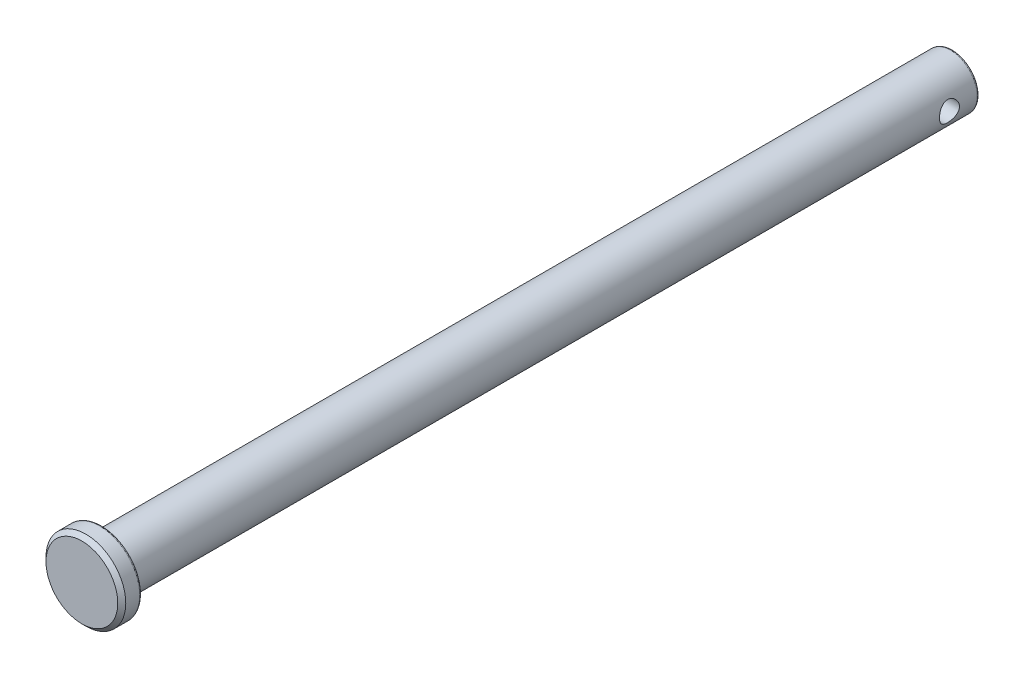
ISO-10303-21;
HEADER;
FILE_DESCRIPTION(('STEP AP214'),'2;1');
FILE_NAME('part.step','',(''),(''),'','','');
FILE_SCHEMA(('AUTOMOTIVE_DESIGN { 1 0 10303 214 1 1 1 1 }'));
ENDSEC;
DATA;
#1=APPLICATION_CONTEXT('core data for automotive mechanical design processes');
#2=APPLICATION_PROTOCOL_DEFINITION('international standard','automotive_design',2000,#1);
#3=PRODUCT_CONTEXT('',#1,'mechanical');
#4=PRODUCT('Part','Part','',(#3));
#5=PRODUCT_RELATED_PRODUCT_CATEGORY('part','',(#4));
#6=PRODUCT_DEFINITION_FORMATION('','',#4);
#7=PRODUCT_DEFINITION_CONTEXT('part definition',#1,'design');
#8=PRODUCT_DEFINITION('design','',#6,#7);
#9=PRODUCT_DEFINITION_SHAPE('','',#8);
#10=(LENGTH_UNIT() NAMED_UNIT(*) SI_UNIT(.MILLI.,.METRE.));
#11=(NAMED_UNIT(*) PLANE_ANGLE_UNIT() SI_UNIT($,.RADIAN.));
#12=(NAMED_UNIT(*) SI_UNIT($,.STERADIAN.) SOLID_ANGLE_UNIT());
#13=UNCERTAINTY_MEASURE_WITH_UNIT(LENGTH_MEASURE(1.E-05),#10,'distance_accuracy_value','');
#14=(GEOMETRIC_REPRESENTATION_CONTEXT(3) GLOBAL_UNCERTAINTY_ASSIGNED_CONTEXT((#13)) GLOBAL_UNIT_ASSIGNED_CONTEXT((#10,
#11,#12)) REPRESENTATION_CONTEXT('',''));
#15=CARTESIAN_POINT('',(0.,0.,0.));
#16=DIRECTION('',(0.,0.,1.));
#17=DIRECTION('',(1.,0.,0.));
#18=AXIS2_PLACEMENT_3D('',#15,#16,#17);
#19=CARTESIAN_POINT('',(0.,4.28625,51.990625));
#20=DIRECTION('',(0.,0.,-1.));
#21=DIRECTION('',(-1.,0.,0.));
#22=AXIS2_PLACEMENT_3D('',#19,#20,#21);
#23=PLANE('',#22);
#24=CARTESIAN_POINT('',(0.,0.,51.9906250000872));
#25=DIRECTION('',(0.,0.,-1.));
#26=DIRECTION('',(-1.,0.,0.));
#27=AXIS2_PLACEMENT_3D('',#24,#25,#26);
#28=CIRCLE('',#27,4.28625000000693);
#29=CARTESIAN_POINT('',(-4.28625000000693,0.,51.9906250000872));
#30=VERTEX_POINT('',#29);
#31=EDGE_CURVE('E169',#30,#30,#28,.T.);
#32=ORIENTED_EDGE('',*,*,#31,.F.);
#33=EDGE_LOOP('',(#32));
#34=FACE_BOUND('',#33,.T.);
#35=ADVANCED_FACE('F16',(#34),#23,.F.);
#36=CARTESIAN_POINT('',(0.,0.,51.5143750000107));
#37=DIRECTION('',(0.,0.,-1.));
#38=DIRECTION('',(-1.,0.,0.));
#39=AXIS2_PLACEMENT_3D('',#36,#37,#38);
#40=CONICAL_SURFACE('',#39,4.76250000008349,0.785398163397448);
#41=CARTESIAN_POINT('',(0.,0.,51.514375));
#42=DIRECTION('',(0.,0.,1.));
#43=DIRECTION('',(1.,0.,0.));
#44=AXIS2_PLACEMENT_3D('',#41,#42,#43);
#45=CIRCLE('',#44,4.7625);
#46=CARTESIAN_POINT('',(4.7625,0.,51.514375));
#47=VERTEX_POINT('',#46);
#48=EDGE_CURVE('E171',#47,#47,#45,.F.);
#49=ORIENTED_EDGE('',*,*,#48,.F.);
#50=EDGE_LOOP('',(#49));
#51=FACE_BOUND('',#50,.T.);
#52=ORIENTED_EDGE('',*,*,#31,.T.);
#53=EDGE_LOOP('',(#52));
#54=FACE_BOUND('',#53,.T.);
#55=ADVANCED_FACE('F225',(#51,#54),#40,.T.);
#56=CARTESIAN_POINT('',(0.,0.,51.990625));
#57=DIRECTION('',(0.,0.,1.));
#58=DIRECTION('',(1.,0.,0.));
#59=AXIS2_PLACEMENT_3D('',#56,#57,#58);
#60=CYLINDRICAL_SURFACE('',#59,4.7625);
#61=ORIENTED_EDGE('',*,*,#48,.T.);
#62=EDGE_LOOP('',(#61));
#63=FACE_BOUND('',#62,.T.);
#64=CARTESIAN_POINT('',(0.,0.,49.863375));
#65=DIRECTION('',(0.,0.,1.));
#66=DIRECTION('',(1.,0.,0.));
#67=AXIS2_PLACEMENT_3D('',#64,#65,#66);
#68=CIRCLE('',#67,4.7625);
#69=CARTESIAN_POINT('',(4.7625,0.,49.863375));
#70=VERTEX_POINT('',#69);
#71=EDGE_CURVE('E64',#70,#70,#68,.F.);
#72=ORIENTED_EDGE('',*,*,#71,.F.);
#73=EDGE_LOOP('',(#72));
#74=FACE_BOUND('',#73,.T.);
#75=ADVANCED_FACE('F190',(#63,#74),#60,.T.);
#76=CARTESIAN_POINT('',(0.,0.,49.863375));
#77=DIRECTION('',(0.,0.,1.));
#78=DIRECTION('',(1.,0.,0.));
#79=AXIS2_PLACEMENT_3D('',#76,#77,#78);
#80=TOROIDAL_SURFACE('',#79,4.5085,0.253999999999999);
#81=ORIENTED_EDGE('',*,*,#71,.T.);
#82=EDGE_LOOP('',(#81));
#83=FACE_BOUND('',#82,.T.);
#84=CARTESIAN_POINT('',(0.,0.,49.609375));
#85=DIRECTION('',(0.,0.,1.));
#86=DIRECTION('',(1.,0.,0.));
#87=AXIS2_PLACEMENT_3D('',#84,#85,#86);
#88=CIRCLE('',#87,4.5085);
#89=CARTESIAN_POINT('',(4.5085,0.,49.609375));
#90=VERTEX_POINT('',#89);
#91=CARTESIAN_POINT('',(-4.5085,0.,49.609375));
#92=VERTEX_POINT('',#91);
#93=EDGE_CURVE('E54',#90,#92,#88,.T.);
#94=ORIENTED_EDGE('',*,*,#93,.T.);
#95=CARTESIAN_POINT('',(0.,0.,49.609375));
#96=DIRECTION('',(0.,0.,1.));
#97=DIRECTION('',(-1.,0.,0.));
#98=AXIS2_PLACEMENT_3D('',#95,#96,#97);
#99=CIRCLE('',#98,4.5085);
#100=EDGE_CURVE('E52',#92,#90,#99,.T.);
#101=ORIENTED_EDGE('',*,*,#100,.T.);
#102=EDGE_LOOP('',(#94,#101));
#103=FACE_BOUND('',#102,.T.);
#104=ADVANCED_FACE('F56',(#83,#103),#80,.T.);
#105=CARTESIAN_POINT('',(0.,0.,-51.990625));
#106=DIRECTION('',(0.,0.,1.));
#107=DIRECTION('',(1.,0.,0.));
#108=AXIS2_PLACEMENT_3D('',#105,#106,#107);
#109=PLANE('',#108);
#110=CARTESIAN_POINT('',(0.,0.,-51.990625));
#111=DIRECTION('',(0.,0.,1.));
#112=DIRECTION('',(-1.,0.,0.));
#113=AXIS2_PLACEMENT_3D('',#110,#111,#112);
#114=CIRCLE('',#113,2.921);
#115=CARTESIAN_POINT('',(-2.921,0.,-51.990625));
#116=VERTEX_POINT('',#115);
#117=CARTESIAN_POINT('',(2.921,0.,-51.990625));
#118=VERTEX_POINT('',#117);
#119=EDGE_CURVE('E59',#116,#118,#114,.T.);
#120=ORIENTED_EDGE('',*,*,#119,.F.);
#121=CARTESIAN_POINT('',(0.,0.,-51.990625));
#122=DIRECTION('',(0.,0.,1.));
#123=DIRECTION('',(1.,0.,0.));
#124=AXIS2_PLACEMENT_3D('',#121,#122,#123);
#125=CIRCLE('',#124,2.921);
#126=EDGE_CURVE('E151',#118,#116,#125,.T.);
#127=ORIENTED_EDGE('',*,*,#126,.F.);
#128=EDGE_LOOP('',(#120,#127));
#129=FACE_BOUND('',#128,.T.);
#130=ADVANCED_FACE('F84',(#129),#109,.F.);
#131=CARTESIAN_POINT('',(0.,3.42899999999999,49.609375));
#132=DIRECTION('',(0.,0.,1.));
#133=DIRECTION('',(1.,0.,0.));
#134=AXIS2_PLACEMENT_3D('',#131,#132,#133);
#135=PLANE('',#134);
#136=CARTESIAN_POINT('',(0.,0.,49.609375));
#137=DIRECTION('',(0.,0.,-1.));
#138=DIRECTION('',(1.,0.,0.));
#139=AXIS2_PLACEMENT_3D('',#136,#137,#138);
#140=CIRCLE('',#139,3.42899999999999);
#141=CARTESIAN_POINT('',(-3.42899999999999,0.,49.609375));
#142=VERTEX_POINT('',#141);
#143=CARTESIAN_POINT('',(3.42899999999999,0.,49.609375));
#144=VERTEX_POINT('',#143);
#145=EDGE_CURVE('E154',#142,#144,#140,.F.);
#146=ORIENTED_EDGE('',*,*,#145,.T.);
#147=CARTESIAN_POINT('',(0.,0.,49.609375));
#148=DIRECTION('',(0.,0.,-1.));
#149=DIRECTION('',(-1.,0.,0.));
#150=AXIS2_PLACEMENT_3D('',#147,#148,#149);
#151=CIRCLE('',#150,3.42899999999999);
#152=EDGE_CURVE('E37',#144,#142,#151,.F.);
#153=ORIENTED_EDGE('',*,*,#152,.T.);
#154=EDGE_LOOP('',(#146,#153));
#155=FACE_BOUND('',#154,.T.);
#156=ORIENTED_EDGE('',*,*,#100,.F.);
#157=ORIENTED_EDGE('',*,*,#93,.F.);
#158=EDGE_LOOP('',(#156,#157));
#159=FACE_BOUND('',#158,.T.);
#160=ADVANCED_FACE('F63',(#155,#159),#135,.F.);
#161=CARTESIAN_POINT('',(0.,0.,-51.736625));
#162=DIRECTION('',(0.,0.,1.));
#163=DIRECTION('',(1.,0.,0.));
#164=AXIS2_PLACEMENT_3D('',#161,#162,#163);
#165=TOROIDAL_SURFACE('',#164,2.921,0.254000000000002);
#166=CARTESIAN_POINT('',(0.,0.,-51.736625));
#167=DIRECTION('',(0.,0.,1.));
#168=DIRECTION('',(1.,0.,0.));
#169=AXIS2_PLACEMENT_3D('',#166,#167,#168);
#170=CIRCLE('',#169,3.17499999999999);
#171=CARTESIAN_POINT('',(3.17499999999999,0.,-51.736625));
#172=VERTEX_POINT('',#171);
#173=EDGE_CURVE('E115',#172,#172,#170,.T.);
#174=ORIENTED_EDGE('',*,*,#173,.F.);
#175=EDGE_LOOP('',(#174));
#176=FACE_BOUND('',#175,.T.);
#177=ORIENTED_EDGE('',*,*,#126,.T.);
#178=ORIENTED_EDGE('',*,*,#119,.T.);
#179=EDGE_LOOP('',(#177,#178));
#180=FACE_BOUND('',#179,.T.);
#181=ADVANCED_FACE('F83',(#176,#180),#165,.T.);
#182=CARTESIAN_POINT('',(0.,0.,49.355375));
#183=DIRECTION('',(0.,0.,1.));
#184=DIRECTION('',(1.,0.,0.));
#185=AXIS2_PLACEMENT_3D('',#182,#183,#184);
#186=TOROIDAL_SURFACE('',#185,3.42899999999999,0.253999999999999);
#187=ORIENTED_EDGE('',*,*,#152,.F.);
#188=ORIENTED_EDGE('',*,*,#145,.F.);
#189=EDGE_LOOP('',(#187,#188));
#190=FACE_BOUND('',#189,.T.);
#191=CARTESIAN_POINT('',(0.,0.,49.355375));
#192=DIRECTION('',(0.,0.,1.));
#193=DIRECTION('',(1.,0.,0.));
#194=AXIS2_PLACEMENT_3D('',#191,#192,#193);
#195=CIRCLE('',#194,3.17499999999999);
#196=CARTESIAN_POINT('',(3.17499999999999,0.,49.355375));
#197=VERTEX_POINT('',#196);
#198=EDGE_CURVE('E29',#197,#197,#195,.F.);
#199=ORIENTED_EDGE('',*,*,#198,.F.);
#200=EDGE_LOOP('',(#199));
#201=FACE_BOUND('',#200,.T.);
#202=ADVANCED_FACE('F117',(#190,#201),#186,.F.);
#203=CARTESIAN_POINT('',(-4.7625,0.,-48.434625));
#204=DIRECTION('',(1.,0.,0.));
#205=DIRECTION('',(0.,0.,-1.));
#206=AXIS2_PLACEMENT_3D('',#203,#204,#205);
#207=CYLINDRICAL_SURFACE('',#206,1.1938);
#208=CARTESIAN_POINT('',(-3.17499999999999,0.,-49.628425));
#209=CARTESIAN_POINT('',(-3.17499714192098,0.0645416416633324,-49.6284212673097));
#210=CARTESIAN_POINT('',(-3.17301098938539,0.129143548946435,-49.6231658412069));
#211=CARTESIAN_POINT('',(-3.16526872569118,0.256486193947588,-49.6023361600074));
#212=CARTESIAN_POINT('',(-3.1595068723136,0.319223944426657,-49.5867461873481));
#213=CARTESIAN_POINT('',(-3.1448366800971,0.440876308456711,-49.5458821277179));
#214=CARTESIAN_POINT('',(-3.13593657209552,0.499800450192939,-49.5206333587259));
#215=CARTESIAN_POINT('',(-3.11587722819063,0.612550306594369,-49.4612712636796));
#216=CARTESIAN_POINT('',(-3.10471810813051,0.666376282488205,-49.4271583921552));
#217=CARTESIAN_POINT('',(-3.08075677202739,0.769731189264313,-49.3495074164179));
#218=CARTESIAN_POINT('',(-3.06790775764152,0.819014039647655,-49.3056563121728));
#219=CARTESIAN_POINT('',(-3.0422442495059,0.90972609486744,-49.2104365184516));
#220=CARTESIAN_POINT('',(-3.02942976958099,0.951152514360447,-49.1590651742164));
#221=CARTESIAN_POINT('',(-3.00474372304801,1.02653622777135,-49.0478646110331));
#222=CARTESIAN_POINT('',(-2.99292709451722,1.06014653651827,-48.9877867480051));
#223=CARTESIAN_POINT('',(-2.97230049762621,1.11667678487838,-48.8623169573107));
#224=CARTESIAN_POINT('',(-2.9634893176016,1.13960103400967,-48.7969271843682));
#225=CARTESIAN_POINT('',(-2.95037010700156,1.17313911276858,-48.6655133268022));
#226=CARTESIAN_POINT('',(-2.94589152187727,1.18422116738411,-48.5996263411277));
#227=CARTESIAN_POINT('',(-2.94144571988617,1.19522418789459,-48.4667874603474));
#228=CARTESIAN_POINT('',(-2.9414766229803,1.19514980499064,-48.3998360206607));
#229=CARTESIAN_POINT('',(-2.94589929518468,1.18420002661998,-48.271061407958));
#230=CARTESIAN_POINT('',(-2.9500283438826,1.17397533042635,-48.2091722046416));
#231=CARTESIAN_POINT('',(-2.96174530896249,1.14409116689025,-48.0880625206669));
#232=CARTESIAN_POINT('',(-2.96933376184123,1.12443023611776,-48.0288424555141));
#233=CARTESIAN_POINT('',(-2.98727219974783,1.07587553842102,-47.9134287367205));
#234=CARTESIAN_POINT('',(-2.99767192435919,1.04681341122358,-47.8573139844748));
#235=CARTESIAN_POINT('',(-3.02004406243738,0.980400021414327,-47.7505718888183));
#236=CARTESIAN_POINT('',(-3.03201694881545,0.943046263902219,-47.6999462038728));
#237=CARTESIAN_POINT('',(-3.05717228830171,0.85814287291554,-47.6020229627208));
#238=CARTESIAN_POINT('',(-3.07038185352712,0.810075437066362,-47.5551802726352));
#239=CARTESIAN_POINT('',(-3.09583259140545,0.706598363697191,-47.4700701769165));
#240=CARTESIAN_POINT('',(-3.10807331454124,0.651185349547343,-47.4318067369131));
#241=CARTESIAN_POINT('',(-3.1304552633654,0.533408277704012,-47.3644326728977));
#242=CARTESIAN_POINT('',(-3.14055908719678,0.47094578939141,-47.3354811055016));
#243=CARTESIAN_POINT('',(-3.15723659440407,0.341623992721842,-47.2886933559786));
#244=CARTESIAN_POINT('',(-3.16381741311849,0.274773881693547,-47.2708346949148));
#245=CARTESIAN_POINT('',(-3.17048346022602,0.172734012582197,-47.2528786011033));
#246=CARTESIAN_POINT('',(-3.17217139867951,0.138370440708816,-47.2483651092517));
#247=CARTESIAN_POINT('',(-3.17443043464748,0.0693437120818132,-47.2423373106619));
#248=CARTESIAN_POINT('',(-3.17500153574913,0.0346805562907873,-47.2408229942906));
#249=CARTESIAN_POINT('',(-3.17499714192098,-0.0645416416633315,-47.2408287326903));
#250=CARTESIAN_POINT('',(-3.17301098938539,-0.129143548946435,-47.246084158793));
#251=CARTESIAN_POINT('',(-3.16526872569118,-0.256486193947588,-47.2669138399926));
#252=CARTESIAN_POINT('',(-3.1595068723136,-0.319223944426657,-47.2825038126519));
#253=CARTESIAN_POINT('',(-3.1448366800971,-0.440876308456713,-47.3233678722821));
#254=CARTESIAN_POINT('',(-3.13593657209552,-0.499800450192943,-47.348616641274));
#255=CARTESIAN_POINT('',(-3.11587722819062,-0.612550306594373,-47.4079787363203));
#256=CARTESIAN_POINT('',(-3.1047181081305,-0.666376282488207,-47.4420916078448));
#257=CARTESIAN_POINT('',(-3.08075677202739,-0.769731189264313,-47.5197425835821));
#258=CARTESIAN_POINT('',(-3.06790775764152,-0.819014039647654,-47.5635936878271));
#259=CARTESIAN_POINT('',(-3.0422442495059,-0.90972609486744,-47.6588134815483));
#260=CARTESIAN_POINT('',(-3.02942976958099,-0.951152514360449,-47.7101848257836));
#261=CARTESIAN_POINT('',(-3.00474372304801,-1.02653622777135,-47.8213853889669));
#262=CARTESIAN_POINT('',(-2.99292709451722,-1.06014653651827,-47.8814632519949));
#263=CARTESIAN_POINT('',(-2.97230049762621,-1.11667678487838,-48.0069330426893));
#264=CARTESIAN_POINT('',(-2.9634893176016,-1.13960103400967,-48.0723228156318));
#265=CARTESIAN_POINT('',(-2.95037010700156,-1.17313911276858,-48.2037366731978));
#266=CARTESIAN_POINT('',(-2.94589152187727,-1.18422116738411,-48.2696236588722));
#267=CARTESIAN_POINT('',(-2.94144571988617,-1.19522418789459,-48.4024625396526));
#268=CARTESIAN_POINT('',(-2.9414766229803,-1.19514980499064,-48.4694139793393));
#269=CARTESIAN_POINT('',(-2.94589929518468,-1.18420002661998,-48.598188592042));
#270=CARTESIAN_POINT('',(-2.9500283438826,-1.17397533042635,-48.6600777953584));
#271=CARTESIAN_POINT('',(-2.96174530896249,-1.14409116689025,-48.7811874793331));
#272=CARTESIAN_POINT('',(-2.96933376184123,-1.12443023611776,-48.8404075444859));
#273=CARTESIAN_POINT('',(-2.98727219974783,-1.07587553842102,-48.9558212632795));
#274=CARTESIAN_POINT('',(-2.99767192435919,-1.04681341122358,-49.0119360155252));
#275=CARTESIAN_POINT('',(-3.02004406243738,-0.980400021414327,-49.1186781111817));
#276=CARTESIAN_POINT('',(-3.03201694881545,-0.943046263902218,-49.1693037961271));
#277=CARTESIAN_POINT('',(-3.05717228830171,-0.858142872915539,-49.2672270372792));
#278=CARTESIAN_POINT('',(-3.07038185352712,-0.810075437066361,-49.3140697273648));
#279=CARTESIAN_POINT('',(-3.09583259140545,-0.706598363697188,-49.3991798230835));
#280=CARTESIAN_POINT('',(-3.10807331454124,-0.651185349547335,-49.4374432630869));
#281=CARTESIAN_POINT('',(-3.1304552633654,-0.533408277704002,-49.5048173271023));
#282=CARTESIAN_POINT('',(-3.14055908719678,-0.470945789391402,-49.5337688944984));
#283=CARTESIAN_POINT('',(-3.15723659440407,-0.341623992721837,-49.5805566440214));
#284=CARTESIAN_POINT('',(-3.16381741311849,-0.274773881693541,-49.5984153050852));
#285=CARTESIAN_POINT('',(-3.17048346022602,-0.172734012582193,-49.6163713988967));
#286=CARTESIAN_POINT('',(-3.17217139867951,-0.138370440708813,-49.6208848907483));
#287=CARTESIAN_POINT('',(-3.17443043464748,-0.0693437120818108,-49.6269126893381));
#288=CARTESIAN_POINT('',(-3.17500153574913,-0.0346805562907855,-49.6284270057094));
#289=CARTESIAN_POINT('',(-3.17499999999999,0.,-49.628425));
#290=B_SPLINE_CURVE_WITH_KNOTS('',3,(#208,#209,#210,#211,#212,#213,#214,#215,#216,#217,#218,
#219,#220,#221,#222,#223,#224,#225,#226,#227,#228,#229,#230,#231,#232,#233,#234,#235,#236,#237,
#238,#239,#240,#241,#242,#243,#244,#245,#246,#247,#248,#249,#250,#251,#252,#253,#254,#255,#256,
#257,#258,#259,#260,#261,#262,#263,#264,#265,#266,#267,#268,#269,#270,#271,#272,#273,#274,#275,
#276,#277,#278,#279,#280,#281,#282,#283,#284,#285,#286,#287,#288,#289),.UNSPECIFIED.,.T.,.F.,(4,
2,2,2,2,2,2,2,2,2,2,2,2,2,2,2,2,2,2,2,2,2,2,2,2,2,2,2,2,2,2,2,2,2,2,2,2,2,2,2,4),(0.,
0.193490592074804,0.387276136552926,0.58055716601698,0.773828286449741,0.974560038218329,
1.17536282299532,1.38385917810834,1.59227137705345,1.79209802846991,1.9918413709127,
2.17955630691759,2.36730036433517,2.55861231069918,2.74998189986394,2.95426053883556,
3.1586334087684,3.36633165080836,3.57360762309685,3.67757744398216,3.78154693092504,
3.97503752299985,4.16882306747797,4.36210409694203,4.55537521737479,4.75610696914338,
4.95690975392037,5.16540610903339,5.3738183079785,5.57364495939496,5.77338830183774,
5.96110323784263,6.14884729526022,6.34015924162422,6.53152883078899,6.73580746976061,
6.94018033969345,7.14787858173341,7.3551545540219,7.45912437490721,7.56309386185009),.UNSPECIFIED.);
#291=CARTESIAN_POINT('',(-3.17499999999999,0.,-49.628425));
#292=VERTEX_POINT('',#291);
#293=EDGE_CURVE('E156',#292,#292,#290,.T.);
#294=ORIENTED_EDGE('',*,*,#293,.F.);
#295=EDGE_LOOP('',(#294));
#296=FACE_BOUND('',#295,.T.);
#297=CARTESIAN_POINT('',(3.17499999999999,0.,-47.240825));
#298=CARTESIAN_POINT('',(3.17499714192098,0.0645416416633326,-47.2408287326903));
#299=CARTESIAN_POINT('',(3.17301098938539,0.129143548946436,-47.246084158793));
#300=CARTESIAN_POINT('',(3.16526872569118,0.256486193947589,-47.2669138399926));
#301=CARTESIAN_POINT('',(3.1595068723136,0.319223944426658,-47.2825038126519));
#302=CARTESIAN_POINT('',(3.1448366800971,0.440876308456712,-47.3233678722821));
#303=CARTESIAN_POINT('',(3.13593657209552,0.499800450192941,-47.348616641274));
#304=CARTESIAN_POINT('',(3.11587722819062,0.612550306594371,-47.4079787363203));
#305=CARTESIAN_POINT('',(3.1047181081305,0.666376282488207,-47.4420916078448));
#306=CARTESIAN_POINT('',(3.08075677202739,0.769731189264313,-47.5197425835821));
#307=CARTESIAN_POINT('',(3.06790775764152,0.819014039647655,-47.5635936878271));
#308=CARTESIAN_POINT('',(3.0422442495059,0.90972609486744,-47.6588134815483));
#309=CARTESIAN_POINT('',(3.02942976958099,0.951152514360449,-47.7101848257836));
#310=CARTESIAN_POINT('',(3.00474372304801,1.02653622777135,-47.8213853889669));
#311=CARTESIAN_POINT('',(2.99292709451722,1.06014653651827,-47.8814632519949));
#312=CARTESIAN_POINT('',(2.97230049762621,1.11667678487838,-48.0069330426893));
#313=CARTESIAN_POINT('',(2.9634893176016,1.13960103400967,-48.0723228156318));
#314=CARTESIAN_POINT('',(2.95037010700156,1.17313911276858,-48.2037366731978));
#315=CARTESIAN_POINT('',(2.94589152187727,1.18422116738411,-48.2696236588722));
#316=CARTESIAN_POINT('',(2.94144571988617,1.19522418789459,-48.4024625396526));
#317=CARTESIAN_POINT('',(2.9414766229803,1.19514980499064,-48.4694139793393));
#318=CARTESIAN_POINT('',(2.94589929518468,1.18420002661998,-48.598188592042));
#319=CARTESIAN_POINT('',(2.9500283438826,1.17397533042635,-48.6600777953584));
#320=CARTESIAN_POINT('',(2.96174530896249,1.14409116689025,-48.7811874793331));
#321=CARTESIAN_POINT('',(2.96933376184123,1.12443023611776,-48.8404075444859));
#322=CARTESIAN_POINT('',(2.98727219974783,1.07587553842102,-48.9558212632795));
#323=CARTESIAN_POINT('',(2.99767192435919,1.04681341122358,-49.0119360155252));
#324=CARTESIAN_POINT('',(3.02004406243738,0.980400021414327,-49.1186781111817));
#325=CARTESIAN_POINT('',(3.03201694881545,0.943046263902218,-49.1693037961271));
#326=CARTESIAN_POINT('',(3.05717228830171,0.858142872915539,-49.2672270372792));
#327=CARTESIAN_POINT('',(3.07038185352712,0.810075437066361,-49.3140697273648));
#328=CARTESIAN_POINT('',(3.09583259140545,0.706598363697187,-49.3991798230835));
#329=CARTESIAN_POINT('',(3.10807331454124,0.651185349547334,-49.4374432630869));
#330=CARTESIAN_POINT('',(3.1304552633654,0.533408277704003,-49.5048173271023));
#331=CARTESIAN_POINT('',(3.14055908719678,0.470945789391405,-49.5337688944984));
#332=CARTESIAN_POINT('',(3.15723659440407,0.34162399272184,-49.5805566440214));
#333=CARTESIAN_POINT('',(3.16381741311849,0.274773881693543,-49.5984153050852));
#334=CARTESIAN_POINT('',(3.17048346022602,0.172734012582192,-49.6163713988967));
#335=CARTESIAN_POINT('',(3.17217139867951,0.138370440708813,-49.6208848907483));
#336=CARTESIAN_POINT('',(3.17443043464748,0.0693437120818111,-49.6269126893381));
#337=CARTESIAN_POINT('',(3.17500153574913,0.0346805562907858,-49.6284270057094));
#338=CARTESIAN_POINT('',(3.17499714192098,-0.0645416416633319,-49.6284212673097));
#339=CARTESIAN_POINT('',(3.17301098938539,-0.129143548946435,-49.6231658412069));
#340=CARTESIAN_POINT('',(3.16526872569118,-0.256486193947587,-49.6023361600074));
#341=CARTESIAN_POINT('',(3.1595068723136,-0.319223944426656,-49.5867461873481));
#342=CARTESIAN_POINT('',(3.1448366800971,-0.440876308456712,-49.5458821277179));
#343=CARTESIAN_POINT('',(3.13593657209552,-0.499800450192941,-49.5206333587259));
#344=CARTESIAN_POINT('',(3.11587722819062,-0.612550306594372,-49.4612712636796));
#345=CARTESIAN_POINT('',(3.1047181081305,-0.666376282488207,-49.4271583921552));
#346=CARTESIAN_POINT('',(3.08075677202739,-0.769731189264312,-49.3495074164179));
#347=CARTESIAN_POINT('',(3.06790775764152,-0.819014039647652,-49.3056563121728));
#348=CARTESIAN_POINT('',(3.0422442495059,-0.909726094867437,-49.2104365184516));
#349=CARTESIAN_POINT('',(3.02942976958099,-0.951152514360446,-49.1590651742164));
#350=CARTESIAN_POINT('',(3.00474372304801,-1.02653622777135,-49.0478646110331));
#351=CARTESIAN_POINT('',(2.99292709451722,-1.06014653651827,-48.9877867480051));
#352=CARTESIAN_POINT('',(2.97230049762621,-1.11667678487838,-48.8623169573107));
#353=CARTESIAN_POINT('',(2.9634893176016,-1.13960103400967,-48.7969271843682));
#354=CARTESIAN_POINT('',(2.95037010700156,-1.17313911276858,-48.6655133268022));
#355=CARTESIAN_POINT('',(2.94589152187727,-1.18422116738411,-48.5996263411277));
#356=CARTESIAN_POINT('',(2.94144571988617,-1.19522418789459,-48.4667874603474));
#357=CARTESIAN_POINT('',(2.9414766229803,-1.19514980499064,-48.3998360206607));
#358=CARTESIAN_POINT('',(2.94589929518468,-1.18420002661998,-48.271061407958));
#359=CARTESIAN_POINT('',(2.9500283438826,-1.17397533042635,-48.2091722046416));
#360=CARTESIAN_POINT('',(2.96174530896249,-1.14409116689025,-48.0880625206669));
#361=CARTESIAN_POINT('',(2.96933376184123,-1.12443023611776,-48.0288424555141));
#362=CARTESIAN_POINT('',(2.98727219974783,-1.07587553842102,-47.9134287367205));
#363=CARTESIAN_POINT('',(2.99767192435919,-1.04681341122358,-47.8573139844748));
#364=CARTESIAN_POINT('',(3.02004406243738,-0.980400021414327,-47.7505718888183));
#365=CARTESIAN_POINT('',(3.03201694881545,-0.943046263902219,-47.6999462038728));
#366=CARTESIAN_POINT('',(3.05717228830171,-0.85814287291554,-47.6020229627208));
#367=CARTESIAN_POINT('',(3.07038185352712,-0.810075437066362,-47.5551802726352));
#368=CARTESIAN_POINT('',(3.09583259140545,-0.706598363697192,-47.4700701769165));
#369=CARTESIAN_POINT('',(3.10807331454124,-0.651185349547343,-47.4318067369131));
#370=CARTESIAN_POINT('',(3.1304552633654,-0.533408277704012,-47.3644326728977));
#371=CARTESIAN_POINT('',(3.14055908719678,-0.47094578939141,-47.3354811055016));
#372=CARTESIAN_POINT('',(3.15723659440407,-0.341623992721842,-47.2886933559786));
#373=CARTESIAN_POINT('',(3.16381741311849,-0.274773881693546,-47.2708346949148));
#374=CARTESIAN_POINT('',(3.17048346022602,-0.172734012582197,-47.2528786011033));
#375=CARTESIAN_POINT('',(3.17217139867951,-0.138370440708816,-47.2483651092517));
#376=CARTESIAN_POINT('',(3.17443043464748,-0.0693437120818127,-47.2423373106619));
#377=CARTESIAN_POINT('',(3.17500153574913,-0.0346805562907865,-47.2408229942906));
#378=CARTESIAN_POINT('',(3.17499999999999,0.,-47.240825));
#379=B_SPLINE_CURVE_WITH_KNOTS('',3,(#297,#298,#299,#300,#301,#302,#303,#304,#305,#306,#307,
#308,#309,#310,#311,#312,#313,#314,#315,#316,#317,#318,#319,#320,#321,#322,#323,#324,#325,#326,
#327,#328,#329,#330,#331,#332,#333,#334,#335,#336,#337,#338,#339,#340,#341,#342,#343,#344,#345,
#346,#347,#348,#349,#350,#351,#352,#353,#354,#355,#356,#357,#358,#359,#360,#361,#362,#363,#364,
#365,#366,#367,#368,#369,#370,#371,#372,#373,#374,#375,#376,#377,#378),.UNSPECIFIED.,.T.,.F.,(4,
2,2,2,2,2,2,2,2,2,2,2,2,2,2,2,2,2,2,2,2,2,2,2,2,2,2,2,2,2,2,2,2,2,2,2,2,2,2,2,4),(0.,
0.193490592074805,0.387276136552927,0.580557166016982,0.773828286449747,0.974560038218334,
1.17536282299532,1.38385917810834,1.59227137705346,1.79209802846992,1.9918413709127,
2.17955630691759,2.36730036433518,2.55861231069918,2.74998189986394,2.95426053883557,
3.15863340876841,3.36633165080837,3.57360762309686,3.67757744398217,3.78154693092504,
3.97503752299985,4.16882306747797,4.36210409694203,4.55537521737478,4.75610696914337,
4.95690975392036,5.16540610903339,5.3738183079785,5.57364495939495,5.77338830183774,
5.96110323784263,6.14884729526021,6.34015924162422,6.53152883078898,6.7358074697606,
6.94018033969344,7.14787858173341,7.3551545540219,7.4591243749072,7.56309386185008),.UNSPECIFIED.);
#380=CARTESIAN_POINT('',(3.17499999999999,0.,-47.240825));
#381=VERTEX_POINT('',#380);
#382=EDGE_CURVE('E10',#381,#381,#379,.T.);
#383=ORIENTED_EDGE('',*,*,#382,.F.);
#384=EDGE_LOOP('',(#383));
#385=FACE_BOUND('',#384,.T.);
#386=ADVANCED_FACE('F120',(#296,#385),#207,.F.);
#387=CARTESIAN_POINT('',(0.,0.,51.990625));
#388=DIRECTION('',(0.,0.,1.));
#389=DIRECTION('',(1.,0.,0.));
#390=AXIS2_PLACEMENT_3D('',#387,#388,#389);
#391=CYLINDRICAL_SURFACE('',#390,3.17499999999999);
#392=ORIENTED_EDGE('',*,*,#293,.T.);
#393=EDGE_LOOP('',(#392));
#394=FACE_BOUND('',#393,.T.);
#395=ORIENTED_EDGE('',*,*,#198,.T.);
#396=EDGE_LOOP('',(#395));
#397=FACE_BOUND('',#396,.T.);
#398=ORIENTED_EDGE('',*,*,#382,.T.);
#399=EDGE_LOOP('',(#398));
#400=FACE_BOUND('',#399,.T.);
#401=ORIENTED_EDGE('',*,*,#173,.T.);
#402=EDGE_LOOP('',(#401));
#403=FACE_BOUND('',#402,.T.);
#404=ADVANCED_FACE('F18',(#394,#397,#400,#403),#391,.T.);
#405=CLOSED_SHELL('',(#35,#55,#75,#104,#130,#160,#181,#202,#386,#404));
#406=MANIFOLD_SOLID_BREP('B1',#405);
#407=ADVANCED_BREP_SHAPE_REPRESENTATION('',(#18,#406),#14);
#408=SHAPE_DEFINITION_REPRESENTATION(#9,#407);
ENDSEC;
END-ISO-10303-21;
